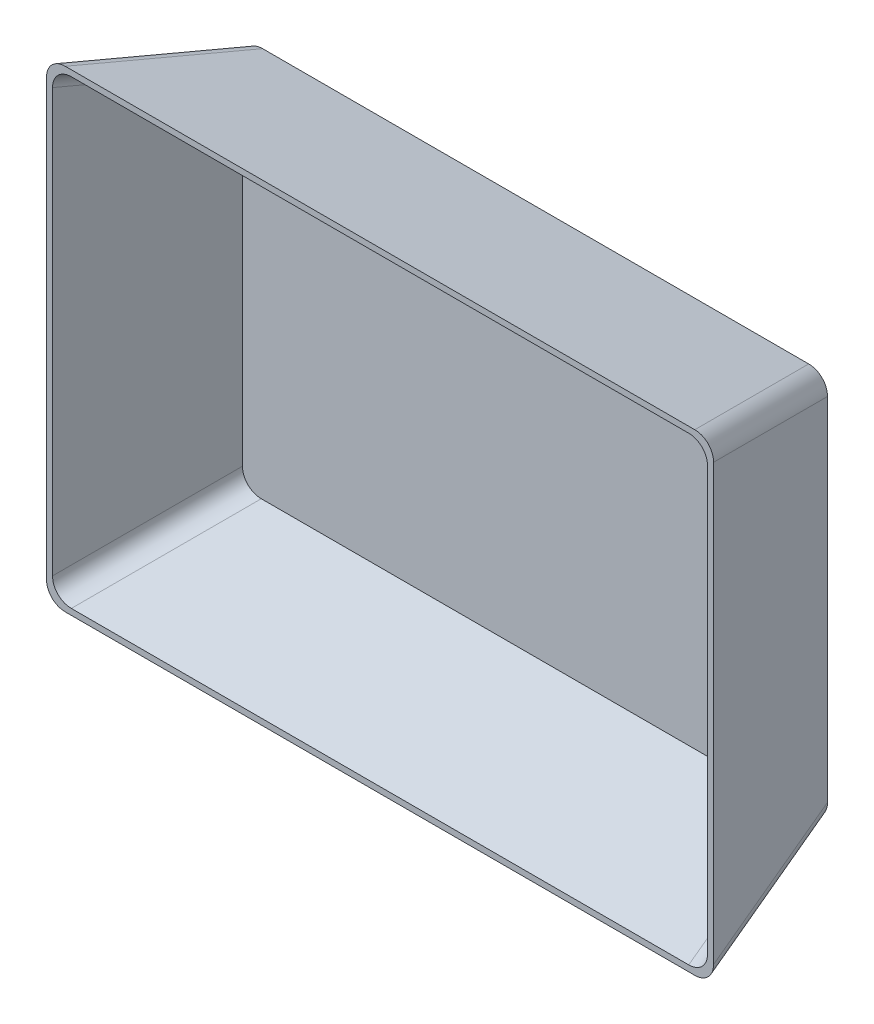
ISO-10303-21;
HEADER;
FILE_DESCRIPTION(('STEP AP214'),'2;1');
FILE_NAME('part.step','',(''),(''),'','','');
FILE_SCHEMA(('AUTOMOTIVE_DESIGN { 1 0 10303 214 1 1 1 1 }'));
ENDSEC;
DATA;
#1=APPLICATION_CONTEXT('core data for automotive mechanical design processes');
#2=APPLICATION_PROTOCOL_DEFINITION('international standard','automotive_design',2000,#1);
#3=PRODUCT_CONTEXT('',#1,'mechanical');
#4=PRODUCT('Part','Part','',(#3));
#5=PRODUCT_RELATED_PRODUCT_CATEGORY('part','',(#4));
#6=PRODUCT_DEFINITION_FORMATION('','',#4);
#7=PRODUCT_DEFINITION_CONTEXT('part definition',#1,'design');
#8=PRODUCT_DEFINITION('design','',#6,#7);
#9=PRODUCT_DEFINITION_SHAPE('','',#8);
#10=(LENGTH_UNIT() NAMED_UNIT(*) SI_UNIT(.MILLI.,.METRE.));
#11=(NAMED_UNIT(*) PLANE_ANGLE_UNIT() SI_UNIT($,.RADIAN.));
#12=(NAMED_UNIT(*) SI_UNIT($,.STERADIAN.) SOLID_ANGLE_UNIT());
#13=UNCERTAINTY_MEASURE_WITH_UNIT(LENGTH_MEASURE(1.E-05),#10,'distance_accuracy_value','');
#14=(GEOMETRIC_REPRESENTATION_CONTEXT(3) GLOBAL_UNCERTAINTY_ASSIGNED_CONTEXT((#13)) GLOBAL_UNIT_ASSIGNED_CONTEXT((#10,
#11,#12)) REPRESENTATION_CONTEXT('',''));
#15=CARTESIAN_POINT('',(0.,0.,0.));
#16=DIRECTION('',(0.,0.,1.));
#17=DIRECTION('',(1.,0.,0.));
#18=AXIS2_PLACEMENT_3D('',#15,#16,#17);
#19=CARTESIAN_POINT('',(0.,0.,80.));
#20=DIRECTION('',(0.,0.,-1.));
#21=DIRECTION('',(-1.,0.,0.));
#22=AXIS2_PLACEMENT_3D('',#19,#20,#21);
#23=PLANE('',#22);
#24=DIRECTION('',(-1.,0.,0.));
#25=VECTOR('',#24,1.);
#26=CARTESIAN_POINT('',(0.,-121.43593539449,80.));
#27=LINE('',#26,#25);
#28=CARTESIAN_POINT('',(-161.776677131599,-121.43593539449,80.));
#29=VERTEX_POINT('',#28);
#30=CARTESIAN_POINT('',(161.776677131599,-121.43593539449,80.));
#31=VERTEX_POINT('',#30);
#32=EDGE_CURVE('E174',#29,#31,#27,.F.);
#33=ORIENTED_EDGE('',*,*,#32,.T.);
#34=CARTESIAN_POINT('',(161.083173590389,-111.083173590389,80.));
#35=DIRECTION('',(0.,0.,-1.));
#36=DIRECTION('',(-0.707106781186548,0.707106781186548,0.));
#37=AXIS2_PLACEMENT_3D('',#34,#35,#36);
#38=ELLIPSE('',#37,10.6938933015482,10.);
#39=CARTESIAN_POINT('',(171.43593539449,-111.776677131599,80.));
#40=VERTEX_POINT('',#39);
#41=EDGE_CURVE('E223',#31,#40,#38,.F.);
#42=ORIENTED_EDGE('',*,*,#41,.T.);
#43=DIRECTION('',(0.,-1.,0.));
#44=VECTOR('',#43,1.);
#45=CARTESIAN_POINT('',(171.43593539449,0.,80.));
#46=LINE('',#45,#44);
#47=CARTESIAN_POINT('',(171.43593539449,111.776677131599,80.));
#48=VERTEX_POINT('',#47);
#49=EDGE_CURVE('E264',#40,#48,#46,.F.);
#50=ORIENTED_EDGE('',*,*,#49,.T.);
#51=CARTESIAN_POINT('',(161.083173590389,111.083173590389,80.));
#52=DIRECTION('',(0.,0.,-1.));
#53=DIRECTION('',(-0.707106781186548,-0.707106781186548,0.));
#54=AXIS2_PLACEMENT_3D('',#51,#52,#53);
#55=ELLIPSE('',#54,10.6938933015482,10.);
#56=CARTESIAN_POINT('',(161.776677131599,121.43593539449,80.));
#57=VERTEX_POINT('',#56);
#58=EDGE_CURVE('E220',#48,#57,#55,.F.);
#59=ORIENTED_EDGE('',*,*,#58,.T.);
#60=DIRECTION('',(1.,0.,0.));
#61=VECTOR('',#60,1.);
#62=CARTESIAN_POINT('',(0.,121.43593539449,80.));
#63=LINE('',#62,#61);
#64=CARTESIAN_POINT('',(-161.776677131599,121.43593539449,80.));
#65=VERTEX_POINT('',#64);
#66=EDGE_CURVE('E267',#57,#65,#63,.F.);
#67=ORIENTED_EDGE('',*,*,#66,.T.);
#68=CARTESIAN_POINT('',(-161.083173590389,111.083173590389,80.));
#69=DIRECTION('',(0.,0.,-1.));
#70=DIRECTION('',(0.707106781186548,-0.707106781186548,0.));
#71=AXIS2_PLACEMENT_3D('',#68,#69,#70);
#72=ELLIPSE('',#71,10.6938933015482,10.);
#73=CARTESIAN_POINT('',(-171.43593539449,111.776677131599,80.));
#74=VERTEX_POINT('',#73);
#75=EDGE_CURVE('E57',#65,#74,#72,.F.);
#76=ORIENTED_EDGE('',*,*,#75,.T.);
#77=DIRECTION('',(0.,1.,0.));
#78=VECTOR('',#77,1.);
#79=CARTESIAN_POINT('',(-171.43593539449,0.,80.));
#80=LINE('',#79,#78);
#81=CARTESIAN_POINT('',(-171.43593539449,-111.776677131599,80.));
#82=VERTEX_POINT('',#81);
#83=EDGE_CURVE('E178',#74,#82,#80,.F.);
#84=ORIENTED_EDGE('',*,*,#83,.T.);
#85=CARTESIAN_POINT('',(-161.083173590389,-111.083173590389,80.));
#86=DIRECTION('',(0.,0.,-1.));
#87=DIRECTION('',(0.707106781186548,0.707106781186548,0.));
#88=AXIS2_PLACEMENT_3D('',#85,#86,#87);
#89=ELLIPSE('',#88,10.6938933015482,10.);
#90=EDGE_CURVE('E218',#82,#29,#89,.F.);
#91=ORIENTED_EDGE('',*,*,#90,.T.);
#92=EDGE_LOOP('',(#33,#42,#50,#59,#67,#76,#84,#91));
#93=FACE_BOUND('',#92,.T.);
#94=DIRECTION('',(0.,-1.,0.));
#95=VECTOR('',#94,1.);
#96=CARTESIAN_POINT('',(168.33010685326,0.,80.));
#97=LINE('',#96,#95);
#98=CARTESIAN_POINT('',(168.33010685326,-108.670848590369,80.));
#99=VERTEX_POINT('',#98);
#100=CARTESIAN_POINT('',(168.33010685326,108.670848590369,80.));
#101=VERTEX_POINT('',#100);
#102=EDGE_CURVE('E242',#99,#101,#97,.F.);
#103=ORIENTED_EDGE('',*,*,#102,.F.);
#104=CARTESIAN_POINT('',(157.977345049159,-107.977345049159,80.));
#105=DIRECTION('',(0.,0.,-1.));
#106=DIRECTION('',(0.707106781186548,-0.707106781186548,0.));
#107=AXIS2_PLACEMENT_3D('',#104,#105,#106);
#108=ELLIPSE('',#107,10.6938933015482,10.);
#109=CARTESIAN_POINT('',(158.670848590369,-118.33010685326,80.));
#110=VERTEX_POINT('',#109);
#111=EDGE_CURVE('E43',#99,#110,#108,.T.);
#112=ORIENTED_EDGE('',*,*,#111,.T.);
#113=DIRECTION('',(-1.,0.,0.));
#114=VECTOR('',#113,1.);
#115=CARTESIAN_POINT('',(0.,-118.33010685326,80.));
#116=LINE('',#115,#114);
#117=CARTESIAN_POINT('',(-158.670848590369,-118.33010685326,80.));
#118=VERTEX_POINT('',#117);
#119=EDGE_CURVE('E240',#118,#110,#116,.F.);
#120=ORIENTED_EDGE('',*,*,#119,.F.);
#121=CARTESIAN_POINT('',(-157.977345049159,-107.977345049159,80.));
#122=DIRECTION('',(0.,0.,-1.));
#123=DIRECTION('',(-0.707106781186548,-0.707106781186548,0.));
#124=AXIS2_PLACEMENT_3D('',#121,#122,#123);
#125=ELLIPSE('',#124,10.6938933015482,10.);
#126=CARTESIAN_POINT('',(-168.33010685326,-108.670848590369,80.));
#127=VERTEX_POINT('',#126);
#128=EDGE_CURVE('E236',#118,#127,#125,.T.);
#129=ORIENTED_EDGE('',*,*,#128,.T.);
#130=DIRECTION('',(0.,1.,0.));
#131=VECTOR('',#130,1.);
#132=CARTESIAN_POINT('',(-168.33010685326,0.,80.));
#133=LINE('',#132,#131);
#134=CARTESIAN_POINT('',(-168.33010685326,108.670848590369,80.));
#135=VERTEX_POINT('',#134);
#136=EDGE_CURVE('E247',#135,#127,#133,.F.);
#137=ORIENTED_EDGE('',*,*,#136,.F.);
#138=CARTESIAN_POINT('',(-157.977345049159,107.977345049159,80.));
#139=DIRECTION('',(0.,0.,-1.));
#140=DIRECTION('',(-0.707106781186548,0.707106781186548,0.));
#141=AXIS2_PLACEMENT_3D('',#138,#139,#140);
#142=ELLIPSE('',#141,10.6938933015482,10.);
#143=CARTESIAN_POINT('',(-158.670848590369,118.33010685326,80.));
#144=VERTEX_POINT('',#143);
#145=EDGE_CURVE('E11',#135,#144,#142,.T.);
#146=ORIENTED_EDGE('',*,*,#145,.T.);
#147=DIRECTION('',(1.,0.,0.));
#148=VECTOR('',#147,1.);
#149=CARTESIAN_POINT('',(0.,118.33010685326,80.));
#150=LINE('',#149,#148);
#151=CARTESIAN_POINT('',(158.670848590369,118.33010685326,80.));
#152=VERTEX_POINT('',#151);
#153=EDGE_CURVE('E253',#152,#144,#150,.F.);
#154=ORIENTED_EDGE('',*,*,#153,.F.);
#155=CARTESIAN_POINT('',(157.977345049159,107.977345049159,80.));
#156=DIRECTION('',(0.,0.,-1.));
#157=DIRECTION('',(0.707106781186548,0.707106781186548,0.));
#158=AXIS2_PLACEMENT_3D('',#155,#156,#157);
#159=ELLIPSE('',#158,10.6938933015482,10.);
#160=EDGE_CURVE('E234',#152,#101,#159,.T.);
#161=ORIENTED_EDGE('',*,*,#160,.T.);
#162=EDGE_LOOP('',(#103,#112,#120,#129,#137,#146,#154,#161));
#163=FACE_BOUND('',#162,.T.);
#164=ADVANCED_FACE('F35',(#93,#163),#23,.F.);
#165=CARTESIAN_POINT('',(150.,-100.,0.));
#166=DIRECTION('',(0.965925826289068,0.,-0.258819045102521));
#167=DIRECTION('',(-0.258819045102521,0.,-0.965925826289068));
#168=AXIS2_PLACEMENT_3D('',#165,#166,#167);
#169=PLANE('',#168);
#170=ORIENTED_EDGE('',*,*,#49,.F.);
#171=DIRECTION('',(0.250562807085732,-0.250562807085732,0.935113126531029));
#172=VECTOR('',#171,1.);
#173=CARTESIAN_POINT('',(150.606424850515,-90.9471665876243,2.26320835309395));
#174=LINE('',#173,#172);
#175=CARTESIAN_POINT('',(150.,-90.3407417371094,0.));
#176=VERTEX_POINT('',#175);
#177=EDGE_CURVE('E202',#40,#176,#174,.F.);
#178=ORIENTED_EDGE('',*,*,#177,.T.);
#179=DIRECTION('',(0.,1.,0.));
#180=VECTOR('',#179,1.);
#181=CARTESIAN_POINT('',(150.,-100.,0.));
#182=LINE('',#181,#180);
#183=CARTESIAN_POINT('',(150.,90.3407417371093,0.));
#184=VERTEX_POINT('',#183);
#185=EDGE_CURVE('E246',#176,#184,#182,.T.);
#186=ORIENTED_EDGE('',*,*,#185,.T.);
#187=DIRECTION('',(0.250562807085732,0.250562807085732,0.935113126531029));
#188=VECTOR('',#187,1.);
#189=CARTESIAN_POINT('',(138.050080791579,78.3908225286879,-44.5977056321721));
#190=LINE('',#189,#188);
#191=EDGE_CURVE('E200',#184,#48,#190,.T.);
#192=ORIENTED_EDGE('',*,*,#191,.T.);
#193=EDGE_LOOP('',(#170,#178,#186,#192));
#194=FACE_BOUND('',#193,.T.);
#195=ADVANCED_FACE('F287',(#194),#169,.T.);
#196=CARTESIAN_POINT('',(-150.,100.,0.));
#197=DIRECTION('',(0.,0.965925826289068,-0.258819045102521));
#198=DIRECTION('',(0.,0.258819045102521,0.965925826289068));
#199=AXIS2_PLACEMENT_3D('',#196,#197,#198);
#200=PLANE('',#199);
#201=DIRECTION('',(-1.,0.,0.));
#202=VECTOR('',#201,1.);
#203=CARTESIAN_POINT('',(-150.,100.,0.));
#204=LINE('',#203,#202);
#205=CARTESIAN_POINT('',(140.340741737109,100.,0.));
#206=VERTEX_POINT('',#205);
#207=CARTESIAN_POINT('',(-140.340741737109,100.,0.));
#208=VERTEX_POINT('',#207);
#209=EDGE_CURVE('E250',#206,#208,#204,.T.);
#210=ORIENTED_EDGE('',*,*,#209,.T.);
#211=DIRECTION('',(-0.250562807085732,0.250562807085732,0.935113126531029));
#212=VECTOR('',#211,1.);
#213=CARTESIAN_POINT('',(-140.947166587624,100.606424850515,2.26320835309395));
#214=LINE('',#213,#212);
#215=EDGE_CURVE('E232',#208,#65,#214,.T.);
#216=ORIENTED_EDGE('',*,*,#215,.T.);
#217=ORIENTED_EDGE('',*,*,#66,.F.);
#218=DIRECTION('',(0.250562807085732,0.250562807085732,0.935113126531029));
#219=VECTOR('',#218,1.);
#220=CARTESIAN_POINT('',(122.11265049922,81.7719087621103,-68.0281626248051));
#221=LINE('',#220,#219);
#222=EDGE_CURVE('E229',#57,#206,#221,.F.);
#223=ORIENTED_EDGE('',*,*,#222,.T.);
#224=EDGE_LOOP('',(#210,#216,#217,#223));
#225=FACE_BOUND('',#224,.T.);
#226=ADVANCED_FACE('F296',(#225),#200,.T.);
#227=CARTESIAN_POINT('',(-150.,-100.,0.));
#228=DIRECTION('',(-0.965925826289068,0.,-0.258819045102521));
#229=DIRECTION('',(-0.258819045102521,0.,0.965925826289068));
#230=AXIS2_PLACEMENT_3D('',#227,#228,#229);
#231=PLANE('',#230);
#232=ORIENTED_EDGE('',*,*,#83,.F.);
#233=DIRECTION('',(-0.250562807085732,0.250562807085732,0.935113126531029));
#234=VECTOR('',#233,1.);
#235=CARTESIAN_POINT('',(-138.050080791579,78.3908225286878,-44.5977056321721));
#236=LINE('',#235,#234);
#237=CARTESIAN_POINT('',(-150.,90.3407417371093,0.));
#238=VERTEX_POINT('',#237);
#239=EDGE_CURVE('E226',#74,#238,#236,.F.);
#240=ORIENTED_EDGE('',*,*,#239,.T.);
#241=DIRECTION('',(0.,-1.,0.));
#242=VECTOR('',#241,1.);
#243=CARTESIAN_POINT('',(-150.,-100.,0.));
#244=LINE('',#243,#242);
#245=CARTESIAN_POINT('',(-150.,-90.3407417371094,0.));
#246=VERTEX_POINT('',#245);
#247=EDGE_CURVE('E259',#238,#246,#244,.T.);
#248=ORIENTED_EDGE('',*,*,#247,.T.);
#249=DIRECTION('',(-0.250562807085732,-0.250562807085732,0.935113126531029));
#250=VECTOR('',#249,1.);
#251=CARTESIAN_POINT('',(-150.606424850515,-90.9471665876243,2.26320835309395));
#252=LINE('',#251,#250);
#253=EDGE_CURVE('E50',#246,#82,#252,.T.);
#254=ORIENTED_EDGE('',*,*,#253,.T.);
#255=EDGE_LOOP('',(#232,#240,#248,#254));
#256=FACE_BOUND('',#255,.T.);
#257=ADVANCED_FACE('F300',(#256),#231,.T.);
#258=CARTESIAN_POINT('',(-150.,-100.,0.));
#259=DIRECTION('',(0.,-0.965925826289068,-0.258819045102521));
#260=DIRECTION('',(0.,0.258819045102521,-0.965925826289068));
#261=AXIS2_PLACEMENT_3D('',#258,#259,#260);
#262=PLANE('',#261);
#263=DIRECTION('',(1.,0.,0.));
#264=VECTOR('',#263,1.);
#265=CARTESIAN_POINT('',(-150.,-100.,0.));
#266=LINE('',#265,#264);
#267=CARTESIAN_POINT('',(-140.340741737109,-100.,0.));
#268=VERTEX_POINT('',#267);
#269=CARTESIAN_POINT('',(140.340741737109,-100.,0.));
#270=VERTEX_POINT('',#269);
#271=EDGE_CURVE('E261',#268,#270,#266,.T.);
#272=ORIENTED_EDGE('',*,*,#271,.T.);
#273=DIRECTION('',(0.250562807085732,-0.250562807085732,0.935113126531029));
#274=VECTOR('',#273,1.);
#275=CARTESIAN_POINT('',(122.11265049922,-81.7719087621104,-68.0281626248051));
#276=LINE('',#275,#274);
#277=EDGE_CURVE('E216',#270,#31,#276,.T.);
#278=ORIENTED_EDGE('',*,*,#277,.T.);
#279=ORIENTED_EDGE('',*,*,#32,.F.);
#280=DIRECTION('',(-0.250562807085732,-0.250562807085732,0.935113126531029));
#281=VECTOR('',#280,1.);
#282=CARTESIAN_POINT('',(-140.947166587624,-100.606424850515,2.26320835309395));
#283=LINE('',#282,#281);
#284=EDGE_CURVE('E213',#29,#268,#283,.F.);
#285=ORIENTED_EDGE('',*,*,#284,.T.);
#286=EDGE_LOOP('',(#272,#278,#279,#285));
#287=FACE_BOUND('',#286,.T.);
#288=ADVANCED_FACE('F275',(#287),#262,.T.);
#289=CARTESIAN_POINT('',(0.,0.,0.));
#290=DIRECTION('',(0.,0.,-1.));
#291=DIRECTION('',(-1.,0.,0.));
#292=AXIS2_PLACEMENT_3D('',#289,#290,#291);
#293=PLANE('',#292);
#294=ORIENTED_EDGE('',*,*,#185,.F.);
#295=CARTESIAN_POINT('',(139.647238195899,-89.6472381958992,0.));
#296=DIRECTION('',(0.,0.,-1.));
#297=DIRECTION('',(-0.707106781186548,0.707106781186548,0.));
#298=AXIS2_PLACEMENT_3D('',#295,#296,#297);
#299=ELLIPSE('',#298,10.6938933015482,10.);
#300=EDGE_CURVE('E211',#176,#270,#299,.T.);
#301=ORIENTED_EDGE('',*,*,#300,.T.);
#302=ORIENTED_EDGE('',*,*,#271,.F.);
#303=CARTESIAN_POINT('',(-139.647238195899,-89.6472381958992,0.));
#304=DIRECTION('',(0.,0.,-1.));
#305=DIRECTION('',(0.707106781186548,0.707106781186548,0.));
#306=AXIS2_PLACEMENT_3D('',#303,#304,#305);
#307=ELLIPSE('',#306,10.6938933015482,10.);
#308=EDGE_CURVE('E205',#268,#246,#307,.T.);
#309=ORIENTED_EDGE('',*,*,#308,.T.);
#310=ORIENTED_EDGE('',*,*,#247,.F.);
#311=CARTESIAN_POINT('',(-139.647238195899,89.6472381958991,0.));
#312=DIRECTION('',(0.,0.,-1.));
#313=DIRECTION('',(0.707106781186548,-0.707106781186548,0.));
#314=AXIS2_PLACEMENT_3D('',#311,#312,#313);
#315=ELLIPSE('',#314,10.6938933015482,10.);
#316=EDGE_CURVE('E209',#238,#208,#315,.T.);
#317=ORIENTED_EDGE('',*,*,#316,.T.);
#318=ORIENTED_EDGE('',*,*,#209,.F.);
#319=CARTESIAN_POINT('',(139.647238195899,89.6472381958991,0.));
#320=DIRECTION('',(0.,0.,-1.));
#321=DIRECTION('',(-0.707106781186548,-0.707106781186548,0.));
#322=AXIS2_PLACEMENT_3D('',#319,#320,#321);
#323=ELLIPSE('',#322,10.6938933015482,10.);
#324=EDGE_CURVE('E207',#206,#184,#323,.T.);
#325=ORIENTED_EDGE('',*,*,#324,.T.);
#326=EDGE_LOOP('',(#294,#301,#302,#309,#310,#317,#318,#325));
#327=FACE_BOUND('',#326,.T.);
#328=ADVANCED_FACE('F279',(#327),#293,.T.);
#329=CARTESIAN_POINT('',(147.102222521133,-100.,0.776457135307564));
#330=DIRECTION('',(0.965925826289068,0.,-0.258819045102521));
#331=DIRECTION('',(-0.258819045102521,0.,-0.965925826289068));
#332=AXIS2_PLACEMENT_3D('',#329,#330,#331);
#333=PLANE('',#332);
#334=ORIENTED_EDGE('',*,*,#102,.T.);
#335=DIRECTION('',(0.250562807085732,0.250562807085732,0.935113126531029));
#336=VECTOR('',#335,1.);
#337=CARTESIAN_POINT('',(148.304443886578,88.6451856236873,5.26320835309395));
#338=LINE('',#337,#336);
#339=CARTESIAN_POINT('',(147.698019036063,88.0387607731724,3.));
#340=VERTEX_POINT('',#339);
#341=EDGE_CURVE('E169',#101,#340,#338,.F.);
#342=ORIENTED_EDGE('',*,*,#341,.T.);
#343=DIRECTION('',(0.,-1.,0.));
#344=VECTOR('',#343,1.);
#345=CARTESIAN_POINT('',(147.698019036063,0.,3.));
#346=LINE('',#345,#344);
#347=CARTESIAN_POINT('',(147.698019036063,-88.0387607731724,3.));
#348=VERTEX_POINT('',#347);
#349=EDGE_CURVE('E152',#348,#340,#346,.F.);
#350=ORIENTED_EDGE('',*,*,#349,.F.);
#351=DIRECTION('',(0.250562807085732,-0.250562807085732,0.935113126531029));
#352=VECTOR('',#351,1.);
#353=CARTESIAN_POINT('',(168.936531703775,-109.277273440884,82.263208353094));
#354=LINE('',#353,#352);
#355=EDGE_CURVE('E166',#348,#99,#354,.T.);
#356=ORIENTED_EDGE('',*,*,#355,.T.);
#357=EDGE_LOOP('',(#334,#342,#350,#356));
#358=FACE_BOUND('',#357,.T.);
#359=ADVANCED_FACE('F165',(#358),#333,.F.);
#360=CARTESIAN_POINT('',(-150.,97.1022225211328,0.776457135307564));
#361=DIRECTION('',(0.,0.965925826289068,-0.258819045102521));
#362=DIRECTION('',(0.,0.258819045102521,0.965925826289068));
#363=AXIS2_PLACEMENT_3D('',#360,#361,#362);
#364=PLANE('',#363);
#365=DIRECTION('',(1.,0.,0.));
#366=VECTOR('',#365,1.);
#367=CARTESIAN_POINT('',(0.,97.6980190360631,3.));
#368=LINE('',#367,#366);
#369=CARTESIAN_POINT('',(138.038760773172,97.6980190360631,3.));
#370=VERTEX_POINT('',#369);
#371=CARTESIAN_POINT('',(-138.038760773172,97.6980190360631,3.));
#372=VERTEX_POINT('',#371);
#373=EDGE_CURVE('E170',#370,#372,#368,.F.);
#374=ORIENTED_EDGE('',*,*,#373,.F.);
#375=DIRECTION('',(0.250562807085732,0.250562807085732,0.935113126531029));
#376=VECTOR('',#375,1.);
#377=CARTESIAN_POINT('',(159.277273440884,118.936531703774,82.2632083530939));
#378=LINE('',#377,#376);
#379=EDGE_CURVE('E189',#370,#152,#378,.T.);
#380=ORIENTED_EDGE('',*,*,#379,.T.);
#381=ORIENTED_EDGE('',*,*,#153,.T.);
#382=DIRECTION('',(-0.250562807085732,0.250562807085732,0.935113126531029));
#383=VECTOR('',#382,1.);
#384=CARTESIAN_POINT('',(-138.645185623687,98.304443886578,5.26320835309395));
#385=LINE('',#384,#383);
#386=EDGE_CURVE('E186',#144,#372,#385,.F.);
#387=ORIENTED_EDGE('',*,*,#386,.T.);
#388=EDGE_LOOP('',(#374,#380,#381,#387));
#389=FACE_BOUND('',#388,.T.);
#390=ADVANCED_FACE('F322',(#389),#364,.F.);
#391=CARTESIAN_POINT('',(-147.102222521133,-100.,0.776457135307564));
#392=DIRECTION('',(-0.965925826289068,0.,-0.258819045102521));
#393=DIRECTION('',(-0.258819045102521,0.,0.965925826289068));
#394=AXIS2_PLACEMENT_3D('',#391,#392,#393);
#395=PLANE('',#394);
#396=ORIENTED_EDGE('',*,*,#136,.T.);
#397=DIRECTION('',(-0.250562807085732,-0.250562807085732,0.935113126531029));
#398=VECTOR('',#397,1.);
#399=CARTESIAN_POINT('',(-148.304443886578,-88.6451856236874,5.26320835309396));
#400=LINE('',#399,#398);
#401=CARTESIAN_POINT('',(-147.698019036063,-88.0387607731725,3.));
#402=VERTEX_POINT('',#401);
#403=EDGE_CURVE('E193',#127,#402,#400,.F.);
#404=ORIENTED_EDGE('',*,*,#403,.T.);
#405=DIRECTION('',(0.,1.,0.));
#406=VECTOR('',#405,1.);
#407=CARTESIAN_POINT('',(-147.698019036063,0.,3.));
#408=LINE('',#407,#406);
#409=CARTESIAN_POINT('',(-147.698019036063,88.0387607731724,3.));
#410=VERTEX_POINT('',#409);
#411=EDGE_CURVE('E474',#410,#402,#408,.F.);
#412=ORIENTED_EDGE('',*,*,#411,.F.);
#413=DIRECTION('',(-0.250562807085732,0.250562807085732,0.935113126531029));
#414=VECTOR('',#413,1.);
#415=CARTESIAN_POINT('',(-168.936531703775,109.277273440884,82.263208353094));
#416=LINE('',#415,#414);
#417=EDGE_CURVE('E191',#410,#135,#416,.T.);
#418=ORIENTED_EDGE('',*,*,#417,.T.);
#419=EDGE_LOOP('',(#396,#404,#412,#418));
#420=FACE_BOUND('',#419,.T.);
#421=ADVANCED_FACE('F327',(#420),#395,.F.);
#422=CARTESIAN_POINT('',(-150.,-97.1022225211328,0.776457135307564));
#423=DIRECTION('',(0.,-0.965925826289068,-0.258819045102521));
#424=DIRECTION('',(0.,0.258819045102521,-0.965925826289068));
#425=AXIS2_PLACEMENT_3D('',#422,#423,#424);
#426=PLANE('',#425);
#427=DIRECTION('',(-1.,0.,0.));
#428=VECTOR('',#427,1.);
#429=CARTESIAN_POINT('',(0.,-97.6980190360632,3.));
#430=LINE('',#429,#428);
#431=CARTESIAN_POINT('',(-138.038760773172,-97.6980190360632,3.));
#432=VERTEX_POINT('',#431);
#433=CARTESIAN_POINT('',(138.038760773172,-97.6980190360632,3.));
#434=VERTEX_POINT('',#433);
#435=EDGE_CURVE('E154',#432,#434,#430,.F.);
#436=ORIENTED_EDGE('',*,*,#435,.F.);
#437=DIRECTION('',(-0.250562807085732,-0.250562807085732,0.935113126531029));
#438=VECTOR('',#437,1.);
#439=CARTESIAN_POINT('',(-159.277273440884,-118.936531703775,82.2632083530939));
#440=LINE('',#439,#438);
#441=EDGE_CURVE('E198',#432,#118,#440,.T.);
#442=ORIENTED_EDGE('',*,*,#441,.T.);
#443=ORIENTED_EDGE('',*,*,#119,.T.);
#444=DIRECTION('',(0.250562807085732,-0.250562807085732,0.935113126531029));
#445=VECTOR('',#444,1.);
#446=CARTESIAN_POINT('',(138.645185623687,-98.3044438865781,5.26320835309395));
#447=LINE('',#446,#445);
#448=EDGE_CURVE('E196',#110,#434,#447,.F.);
#449=ORIENTED_EDGE('',*,*,#448,.T.);
#450=EDGE_LOOP('',(#436,#442,#443,#449));
#451=FACE_BOUND('',#450,.T.);
#452=ADVANCED_FACE('F244',(#451),#426,.F.);
#453=CARTESIAN_POINT('',(0.,0.,3.));
#454=DIRECTION('',(0.,0.,-1.));
#455=DIRECTION('',(-1.,0.,0.));
#456=AXIS2_PLACEMENT_3D('',#453,#454,#455);
#457=PLANE('',#456);
#458=ORIENTED_EDGE('',*,*,#349,.T.);
#459=CARTESIAN_POINT('',(137.345257231962,87.3452572319623,3.));
#460=DIRECTION('',(0.,0.,-1.));
#461=DIRECTION('',(0.707106781186548,0.707106781186548,0.));
#462=AXIS2_PLACEMENT_3D('',#459,#460,#461);
#463=ELLIPSE('',#462,10.6938933015482,10.);
#464=EDGE_CURVE('E184',#340,#370,#463,.F.);
#465=ORIENTED_EDGE('',*,*,#464,.T.);
#466=ORIENTED_EDGE('',*,*,#373,.T.);
#467=CARTESIAN_POINT('',(-137.345257231962,87.3452572319623,3.));
#468=DIRECTION('',(0.,0.,-1.));
#469=DIRECTION('',(-0.707106781186548,0.707106781186548,0.));
#470=AXIS2_PLACEMENT_3D('',#467,#468,#469);
#471=ELLIPSE('',#470,10.6938933015482,10.);
#472=EDGE_CURVE('E160',#372,#410,#471,.F.);
#473=ORIENTED_EDGE('',*,*,#472,.T.);
#474=ORIENTED_EDGE('',*,*,#411,.T.);
#475=CARTESIAN_POINT('',(-137.345257231962,-87.3452572319623,3.));
#476=DIRECTION('',(0.,0.,-1.));
#477=DIRECTION('',(-0.707106781186548,-0.707106781186548,0.));
#478=AXIS2_PLACEMENT_3D('',#475,#476,#477);
#479=ELLIPSE('',#478,10.6938933015482,10.);
#480=EDGE_CURVE('E159',#402,#432,#479,.F.);
#481=ORIENTED_EDGE('',*,*,#480,.T.);
#482=ORIENTED_EDGE('',*,*,#435,.T.);
#483=CARTESIAN_POINT('',(137.345257231962,-87.3452572319623,3.));
#484=DIRECTION('',(0.,0.,-1.));
#485=DIRECTION('',(0.707106781186548,-0.707106781186548,0.));
#486=AXIS2_PLACEMENT_3D('',#483,#484,#485);
#487=ELLIPSE('',#486,10.6938933015482,10.);
#488=EDGE_CURVE('E149',#434,#348,#487,.F.);
#489=ORIENTED_EDGE('',*,*,#488,.T.);
#490=EDGE_LOOP('',(#458,#465,#466,#473,#474,#481,#482,#489));
#491=FACE_BOUND('',#490,.T.);
#492=ADVANCED_FACE('F151',(#491),#457,.F.);
#493=CARTESIAN_POINT('',(125.674972504975,75.6749725049751,-40.5540955399111));
#494=DIRECTION('',(0.250562807085732,0.250562807085732,0.935113126531029));
#495=DIRECTION('',(0.965925826289068,0.,-0.258819045102521));
#496=AXIS2_PLACEMENT_3D('',#493,#494,#495);
#497=CYLINDRICAL_SURFACE('',#496,10.);
#498=ORIENTED_EDGE('',*,*,#160,.F.);
#499=ORIENTED_EDGE('',*,*,#379,.F.);
#500=ORIENTED_EDGE('',*,*,#464,.F.);
#501=ORIENTED_EDGE('',*,*,#341,.F.);
#502=EDGE_LOOP('',(#498,#499,#500,#501));
#503=FACE_BOUND('',#502,.T.);
#504=ADVANCED_FACE('F337',(#503),#497,.F.);
#505=CARTESIAN_POINT('',(-138.231316563911,-88.2313165639115,6.30681844535491));
#506=DIRECTION('',(-0.250562807085732,-0.250562807085732,0.935113126531029));
#507=DIRECTION('',(0.965925826289068,0.,0.258819045102521));
#508=AXIS2_PLACEMENT_3D('',#505,#506,#507);
#509=CYLINDRICAL_SURFACE('',#508,10.);
#510=ORIENTED_EDGE('',*,*,#128,.F.);
#511=ORIENTED_EDGE('',*,*,#441,.F.);
#512=ORIENTED_EDGE('',*,*,#480,.F.);
#513=ORIENTED_EDGE('',*,*,#403,.F.);
#514=EDGE_LOOP('',(#510,#511,#512,#513));
#515=FACE_BOUND('',#514,.T.);
#516=ADVANCED_FACE('F341',(#515),#509,.F.);
#517=CARTESIAN_POINT('',(119.396800475507,-69.396800475507,-63.9845525325441));
#518=DIRECTION('',(0.250562807085732,-0.250562807085732,0.935113126531029));
#519=DIRECTION('',(0.965925826289068,0.,-0.258819045102521));
#520=AXIS2_PLACEMENT_3D('',#517,#518,#519);
#521=CYLINDRICAL_SURFACE('',#520,10.);
#522=ORIENTED_EDGE('',*,*,#111,.F.);
#523=ORIENTED_EDGE('',*,*,#355,.F.);
#524=ORIENTED_EDGE('',*,*,#488,.F.);
#525=ORIENTED_EDGE('',*,*,#448,.F.);
#526=EDGE_LOOP('',(#522,#523,#524,#525));
#527=FACE_BOUND('',#526,.T.);
#528=ADVANCED_FACE('F173',(#527),#521,.F.);
#529=CARTESIAN_POINT('',(-138.231316563911,88.2313165639115,6.30681844535492));
#530=DIRECTION('',(-0.250562807085732,0.250562807085732,0.935113126531029));
#531=DIRECTION('',(0.965925826289068,0.,0.258819045102521));
#532=AXIS2_PLACEMENT_3D('',#529,#530,#531);
#533=CYLINDRICAL_SURFACE('',#532,10.);
#534=ORIENTED_EDGE('',*,*,#145,.F.);
#535=ORIENTED_EDGE('',*,*,#417,.F.);
#536=ORIENTED_EDGE('',*,*,#472,.F.);
#537=ORIENTED_EDGE('',*,*,#386,.F.);
#538=EDGE_LOOP('',(#534,#535,#536,#537));
#539=FACE_BOUND('',#538,.T.);
#540=ADVANCED_FACE('F353',(#539),#533,.F.);
#541=CARTESIAN_POINT('',(140.947166587624,-90.9471665876243,4.85139880411917));
#542=DIRECTION('',(-0.250562807085732,0.250562807085732,-0.935113126531029));
#543=DIRECTION('',(-0.965925826289068,0.,0.258819045102521));
#544=AXIS2_PLACEMENT_3D('',#541,#542,#543);
#545=CYLINDRICAL_SURFACE('',#544,10.);
#546=ORIENTED_EDGE('',*,*,#41,.F.);
#547=ORIENTED_EDGE('',*,*,#277,.F.);
#548=ORIENTED_EDGE('',*,*,#300,.F.);
#549=ORIENTED_EDGE('',*,*,#177,.F.);
#550=EDGE_LOOP('',(#546,#547,#548,#549));
#551=FACE_BOUND('',#550,.T.);
#552=ADVANCED_FACE('F284',(#551),#545,.T.);
#553=CARTESIAN_POINT('',(-128.390822528688,78.3908225286878,-42.0095151811468));
#554=DIRECTION('',(0.250562807085732,-0.250562807085732,-0.935113126531029));
#555=DIRECTION('',(-0.965925826289068,0.,-0.258819045102521));
#556=AXIS2_PLACEMENT_3D('',#553,#554,#555);
#557=CYLINDRICAL_SURFACE('',#556,10.);
#558=ORIENTED_EDGE('',*,*,#75,.F.);
#559=ORIENTED_EDGE('',*,*,#215,.F.);
#560=ORIENTED_EDGE('',*,*,#316,.F.);
#561=ORIENTED_EDGE('',*,*,#239,.F.);
#562=EDGE_LOOP('',(#558,#559,#560,#561));
#563=FACE_BOUND('',#562,.T.);
#564=ADVANCED_FACE('F299',(#563),#557,.T.);
#565=CARTESIAN_POINT('',(122.11265049922,72.1126504992197,-65.4399721737798));
#566=DIRECTION('',(-0.250562807085732,-0.250562807085732,-0.935113126531029));
#567=DIRECTION('',(-0.965925826289068,0.,0.258819045102521));
#568=AXIS2_PLACEMENT_3D('',#565,#566,#567);
#569=CYLINDRICAL_SURFACE('',#568,10.);
#570=ORIENTED_EDGE('',*,*,#58,.F.);
#571=ORIENTED_EDGE('',*,*,#191,.F.);
#572=ORIENTED_EDGE('',*,*,#324,.F.);
#573=ORIENTED_EDGE('',*,*,#222,.F.);
#574=EDGE_LOOP('',(#570,#571,#572,#573));
#575=FACE_BOUND('',#574,.T.);
#576=ADVANCED_FACE('F293',(#575),#569,.T.);
#577=CARTESIAN_POINT('',(-140.947166587624,-90.9471665876243,4.85139880411917));
#578=DIRECTION('',(0.250562807085732,0.250562807085732,-0.935113126531029));
#579=DIRECTION('',(-0.965925826289068,0.,-0.258819045102521));
#580=AXIS2_PLACEMENT_3D('',#577,#578,#579);
#581=CYLINDRICAL_SURFACE('',#580,10.);
#582=ORIENTED_EDGE('',*,*,#90,.F.);
#583=ORIENTED_EDGE('',*,*,#253,.F.);
#584=ORIENTED_EDGE('',*,*,#308,.F.);
#585=ORIENTED_EDGE('',*,*,#284,.F.);
#586=EDGE_LOOP('',(#582,#583,#584,#585));
#587=FACE_BOUND('',#586,.T.);
#588=ADVANCED_FACE('F37',(#587),#581,.T.);
#589=CLOSED_SHELL('',(#164,#195,#226,#257,#288,#328,#359,#390,#421,#452,#492,#504,#516,#528,
#540,#552,#564,#576,#588));
#590=MANIFOLD_SOLID_BREP('B2',#589);
#591=ADVANCED_BREP_SHAPE_REPRESENTATION('',(#18,#590),#14);
#592=SHAPE_DEFINITION_REPRESENTATION(#9,#591);
ENDSEC;
END-ISO-10303-21;
